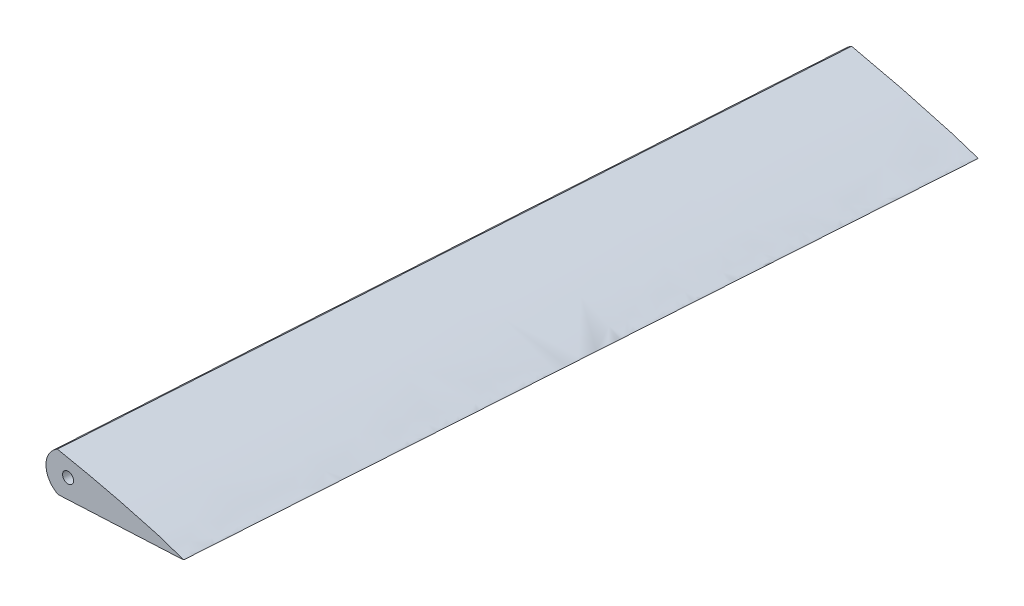
ISO-10303-21;
HEADER;
FILE_DESCRIPTION(('STEP AP214'),'2;1');
FILE_NAME('part.step','',(''),(''),'','','');
FILE_SCHEMA(('AUTOMOTIVE_DESIGN { 1 0 10303 214 1 1 1 1 }'));
ENDSEC;
DATA;
#1=APPLICATION_CONTEXT('core data for automotive mechanical design processes');
#2=APPLICATION_PROTOCOL_DEFINITION('international standard','automotive_design',2000,#1);
#3=PRODUCT_CONTEXT('',#1,'mechanical');
#4=PRODUCT('Part','Part','',(#3));
#5=PRODUCT_RELATED_PRODUCT_CATEGORY('part','',(#4));
#6=PRODUCT_DEFINITION_FORMATION('','',#4);
#7=PRODUCT_DEFINITION_CONTEXT('part definition',#1,'design');
#8=PRODUCT_DEFINITION('design','',#6,#7);
#9=PRODUCT_DEFINITION_SHAPE('','',#8);
#10=(LENGTH_UNIT() NAMED_UNIT(*) SI_UNIT(.MILLI.,.METRE.));
#11=(NAMED_UNIT(*) PLANE_ANGLE_UNIT() SI_UNIT($,.RADIAN.));
#12=(NAMED_UNIT(*) SI_UNIT($,.STERADIAN.) SOLID_ANGLE_UNIT());
#13=UNCERTAINTY_MEASURE_WITH_UNIT(LENGTH_MEASURE(1.E-05),#10,'distance_accuracy_value','');
#14=(GEOMETRIC_REPRESENTATION_CONTEXT(3) GLOBAL_UNCERTAINTY_ASSIGNED_CONTEXT((#13)) GLOBAL_UNIT_ASSIGNED_CONTEXT((#10,
#11,#12)) REPRESENTATION_CONTEXT('',''));
#15=CARTESIAN_POINT('',(0.,0.,0.));
#16=DIRECTION('',(0.,0.,1.));
#17=DIRECTION('',(1.,0.,0.));
#18=AXIS2_PLACEMENT_3D('',#15,#16,#17);
#19=CARTESIAN_POINT('',(116.506559430036,-5.01166499395291,300.));
#20=DIRECTION('',(0.,0.,-1.));
#21=DIRECTION('',(-1.,0.,0.));
#22=AXIS2_PLACEMENT_3D('',#19,#20,#21);
#23=PLANE('',#22);
#24=CARTESIAN_POINT('',(79.0070440421193,2.39921606308295,300.));
#25=DIRECTION('',(0.,0.,-1.));
#26=DIRECTION('',(-0.999407136814944,-0.0344292736396727,0.));
#27=AXIS2_PLACEMENT_3D('',#24,#25,#26);
#28=ELLIPSE('',#27,1.00226341484275,0.999999999999993);
#29=CARTESIAN_POINT('',(78.005374832357,2.36470886171429,300.));
#30=VERTEX_POINT('',#29);
#31=EDGE_CURVE('E58',#30,#30,#28,.F.);
#32=ORIENTED_EDGE('',*,*,#31,.F.);
#33=EDGE_LOOP('',(#32));
#34=FACE_BOUND('',#33,.T.);
#35=CARTESIAN_POINT('',(100.,0.,300.));
#36=CARTESIAN_POINT('',(100.014923169262,0.0592388089626518,300.));
#37=CARTESIAN_POINT('',(98.3529769440514,0.511038186945055,300.));
#38=CARTESIAN_POINT('',(97.0969794574008,1.03966162187566,300.));
#39=CARTESIAN_POINT('',(94.4018178812771,1.80139976342404,300.));
#40=CARTESIAN_POINT('',(91.5774953760021,2.59080174867619,300.));
#41=CARTESIAN_POINT('',(88.1259798370144,3.47753080508084,300.));
#42=CARTESIAN_POINT('',(84.2217100096211,4.40446850526963,300.));
#43=CARTESIAN_POINT('',(79.8953408602356,5.35215076036016,300.));
#44=CARTESIAN_POINT('',(75.2308646597816,6.2701026833677,300.));
#45=CARTESIAN_POINT('',(70.3041328387238,7.11696708440821,300.));
#46=CARTESIAN_POINT('',(65.2008228846164,7.85540207923427,300.));
#47=CARTESIAN_POINT('',(60.0084258675896,8.45749052318448,300.));
#48=CARTESIAN_POINT('',(54.8154414029379,8.89296179445461,300.));
#49=CARTESIAN_POINT('',(49.7087787786779,9.11718139088869,300.));
#50=CARTESIAN_POINT('',(44.7749515151268,9.08549151114679,300.));
#51=CARTESIAN_POINT('',(40.1001215647839,8.78047675865518,300.));
#52=CARTESIAN_POINT('',(35.7650377112056,8.22003855734951,300.));
#53=CARTESIAN_POINT('',(31.8431393592005,7.43515761318965,300.));
#54=CARTESIAN_POINT('',(28.3975621307644,6.47381434625063,300.));
#55=CARTESIAN_POINT('',(25.4743709849585,5.36057571079238,300.));
#56=CARTESIAN_POINT('',(23.1643125092464,4.08874700360212,300.));
#57=CARTESIAN_POINT('',(21.4182453437574,2.80505456301613,300.));
#58=CARTESIAN_POINT('',(20.3342940907016,1.4857636098498,300.));
#59=CARTESIAN_POINT('',(19.848876137766,0.16094790784733,300.));
#60=CARTESIAN_POINT('',(20.5607003857686,-1.62078308380909,300.));
#61=CARTESIAN_POINT('',(23.3461486495499,-2.47062334575145,300.));
#62=CARTESIAN_POINT('',(27.0944757373181,-3.21353066773721,300.));
#63=CARTESIAN_POINT('',(32.0919146293912,-3.38211658366619,300.));
#64=CARTESIAN_POINT('',(38.0597809883925,-3.29061362877646,300.));
#65=CARTESIAN_POINT('',(44.8910379391885,-2.95007097060458,300.));
#66=CARTESIAN_POINT('',(52.2961856480144,-2.58123272556939,300.));
#67=CARTESIAN_POINT('',(60.0015784426429,-2.17844007735752,300.));
#68=CARTESIAN_POINT('',(67.7029961352897,-1.72772962023577,300.));
#69=CARTESIAN_POINT('',(75.1137779773506,-1.27940221867296,300.));
#70=CARTESIAN_POINT('',(81.9255850266116,-0.915018444337756,300.));
#71=CARTESIAN_POINT('',(87.9561922617108,-0.63965732422303,300.));
#72=CARTESIAN_POINT('',(92.7389461096696,-0.400523517451224,300.));
#73=CARTESIAN_POINT('',(96.6958495882715,-0.306482613810462,300.));
#74=CARTESIAN_POINT('',(98.3883941773635,-0.0811743747246907,300.));
#75=CARTESIAN_POINT('',(99.9859090432853,-0.0559352693961097,300.));
#76=CARTESIAN_POINT('',(100.,0.,300.));
#77=B_SPLINE_CURVE_WITH_KNOTS('',3,(#35,#36,#37,#38,#39,#40,#41,#42,#43,#44,#45,#46,#47,#48,#49,
#50,#51,#52,#53,#54,#55,#56,#57,#58,#59,#60,#61,#62,#63,#64,#65,#66,#67,#68,#69,#70,#71,#72,#73,
#74,#75,#76),.UNSPECIFIED.,.T.,.F.,(4,1,1,1,1,1,1,1,1,1,1,1,1,1,1,1,1,1,1,1,1,1,1,1,1,1,1,1,1,1,
1,1,1,1,1,1,1,1,1,4),(0.,0.00495576371400358,0.0195005280764471,0.0341339283486635,
0.0524049542143257,0.0739943309224443,0.0984931531585991,0.125474601337429,0.154451971064024,
0.184909300231469,0.216326676925909,0.248168985989691,0.279908729565615,0.311030457196045,
0.341049811862573,0.369546227571225,0.396130574732561,0.420447044709539,0.442179640217013,
0.461102572305862,0.477136471921637,0.490041484410884,0.500147947583578,0.508077763123304,
0.514148335024584,0.53273119249296,0.555552546441872,0.58573949839938,0.622463906786317,
0.664407467873401,0.709926080574513,0.757276032828189,0.804638844685232,0.850179122578555,
0.892141924950279,0.928905522286394,0.959074072533095,0.981494735532468,0.995320601759886,1.),.UNSPECIFIED.);
#78=CARTESIAN_POINT('',(77.2030403463395,-1.17079988015967,300.));
#79=VERTEX_POINT('',#78);
#80=CARTESIAN_POINT('',(77.0720573084049,5.90216616041599,300.));
#81=VERTEX_POINT('',#80);
#82=EDGE_CURVE('E86',#79,#81,#77,.T.);
#83=ORIENTED_EDGE('',*,*,#82,.T.);
#84=CARTESIAN_POINT('',(79.009263679597,2.40043779807845,300.));
#85=DIRECTION('',(0.,0.,-1.));
#86=DIRECTION('',(0.99955910558253,0.0296916561857644,0.));
#87=AXIS2_PLACEMENT_3D('',#84,#85,#86);
#88=ELLIPSE('',#87,4.00888703081333,4.);
#89=EDGE_CURVE('E81',#79,#81,#88,.T.);
#90=ORIENTED_EDGE('',*,*,#89,.F.);
#91=EDGE_LOOP('',(#83,#90));
#92=FACE_BOUND('',#91,.T.);
#93=ADVANCED_FACE('F51',(#34,#92),#23,.F.);
#94=CARTESIAN_POINT('',(84.0004709817086,-6.2458455088739,165.));
#95=DIRECTION('',(0.,0.,-1.));
#96=DIRECTION('',(-1.,0.,0.));
#97=AXIS2_PLACEMENT_3D('',#94,#95,#96);
#98=PLANE('',#97);
#99=CARTESIAN_POINT('',(88.0093501864415,2.66778314335208,165.));
#100=DIRECTION('',(0.,0.,-1.));
#101=DIRECTION('',(0.99955910558253,0.0296916561857644,0.));
#102=AXIS2_PLACEMENT_3D('',#99,#100,#101);
#103=ELLIPSE('',#102,1.00222175770333,0.999999999999997);
#104=CARTESIAN_POINT('',(89.0111300701667,2.6975407672037,165.));
#105=VERTEX_POINT('',#104);
#106=EDGE_CURVE('E91',#105,#105,#103,.T.);
#107=ORIENTED_EDGE('',*,*,#106,.F.);
#108=EDGE_LOOP('',(#107));
#109=FACE_BOUND('',#108,.T.);
#110=CARTESIAN_POINT('',(88.0093501864414,2.66778314335208,165.));
#111=DIRECTION('',(0.,0.,-1.));
#112=DIRECTION('',(0.99955910558253,0.0296916561857644,0.));
#113=AXIS2_PLACEMENT_3D('',#110,#111,#112);
#114=ELLIPSE('',#113,4.00888703081333,4.);
#115=CARTESIAN_POINT('',(86.0816494037055,6.17473102255661,165.000000000001));
#116=VERTEX_POINT('',#115);
#117=CARTESIAN_POINT('',(86.7681154949798,-1.13582714403182,165.));
#118=VERTEX_POINT('',#117);
#119=EDGE_CURVE('E13',#116,#118,#114,.F.);
#120=ORIENTED_EDGE('',*,*,#119,.F.);
#121=CARTESIAN_POINT('',(84.0004709817086,-1.27715482212734,165.));
#122=CARTESIAN_POINT('',(84.4103416419567,-1.25569715642511,165.));
#123=CARTESIAN_POINT('',(84.8202241691838,-1.23446558416985,165.));
#124=CARTESIAN_POINT('',(85.6400125913986,-1.19247616326863,165.));
#125=CARTESIAN_POINT('',(86.0499184863336,-1.17171831359439,165.));
#126=CARTESIAN_POINT('',(86.8697547087213,-1.13069779866227,165.));
#127=CARTESIAN_POINT('',(87.2796850361529,-1.11043513298336,165.));
#128=CARTESIAN_POINT('',(88.0995680016719,-1.07036447933727,165.));
#129=CARTESIAN_POINT('',(88.5095206397663,-1.05055649151186,165.));
#130=CARTESIAN_POINT('',(89.3294162844653,-1.01124581815784,165.));
#131=CARTESIAN_POINT('',(89.7393592902124,-0.991743114695151,165.));
#132=CARTESIAN_POINT('',(90.5592530479397,-0.952913234080104,165.));
#133=CARTESIAN_POINT('',(90.9692037999087,-0.933586056692733,165.));
#134=CARTESIAN_POINT('',(91.7891058212412,-0.894973491753583,165.));
#135=CARTESIAN_POINT('',(92.1990570905978,-0.875688104055088,165.));
#136=CARTESIAN_POINT('',(93.0189527840079,-0.837022356387112,165.));
#137=CARTESIAN_POINT('',(93.4288972080873,-0.817641996968352,165.));
#138=CARTESIAN_POINT('',(94.0438206110605,-0.788400815355857,165.));
#139=CARTESIAN_POINT('',(94.2488036249985,-0.778624957527131,165.));
#140=CARTESIAN_POINT('',(94.6587656109629,-0.758988890726824,165.));
#141=CARTESIAN_POINT('',(94.8637445829891,-0.749128681754949,165.));
#142=CARTESIAN_POINT('',(95.4786801258529,-0.719499721356093,165.));
#143=CARTESIAN_POINT('',(95.8886343703241,-0.699682682070747,165.));
#144=CARTESIAN_POINT('',(96.7085731090096,-0.660568051507781,165.));
#145=CARTESIAN_POINT('',(97.1185576035439,-0.641270466886279,165.));
#146=CARTESIAN_POINT('',(97.9385905393802,-0.603800688968483,165.));
#147=CARTESIAN_POINT('',(98.3486389821818,-0.58562852804694,165.));
#148=CARTESIAN_POINT('',(98.963781505587,-0.559623011972516,165.));
#149=CARTESIAN_POINT('',(99.1688490750589,-0.55116297263522,165.));
#150=CARTESIAN_POINT('',(99.5790033538564,-0.534722937819139,165.));
#151=CARTESIAN_POINT('',(99.7840900631696,-0.526742942031726,165.));
#152=CARTESIAN_POINT('',(100.194281022082,-0.511306158537653,165.));
#153=CARTESIAN_POINT('',(100.399385271464,-0.50384936507924,165.));
#154=CARTESIAN_POINT('',(100.80961507413,-0.489550420527161,165.));
#155=CARTESIAN_POINT('',(101.014740627413,-0.482708269397327,165.));
#156=CARTESIAN_POINT('',(101.424968991849,-0.469287282036709,165.));
#157=CARTESIAN_POINT('',(101.630071801735,-0.462708406042353,165.));
#158=CARTESIAN_POINT('',(102.040272236234,-0.449367826696778,165.));
#159=CARTESIAN_POINT('',(102.245369860829,-0.442606122786973,165.));
#160=CARTESIAN_POINT('',(102.655482707591,-0.428474728623181,165.));
#161=CARTESIAN_POINT('',(102.860497935961,-0.421105222242066,165.));
#162=CARTESIAN_POINT('',(103.270485201541,-0.405265834453187,165.));
#163=CARTESIAN_POINT('',(103.475457239084,-0.396795961881638,165.));
#164=CARTESIAN_POINT('',(103.953829192812,-0.37507965071539,165.));
#165=CARTESIAN_POINT('',(104.227200188111,-0.361182935817716,165.));
#166=CARTESIAN_POINT('',(104.773668154181,-0.328493470663739,165.));
#167=CARTESIAN_POINT('',(105.04676513065,-0.309700824425825,165.));
#168=CARTESIAN_POINT('',(105.455950491974,-0.275618700778907,165.));
#169=CARTESIAN_POINT('',(105.59228620906,-0.263273858860942,165.));
#170=CARTESIAN_POINT('',(105.864905001727,-0.237997029188464,165.));
#171=CARTESIAN_POINT('',(106.001188075157,-0.225065019577515,165.));
#172=CARTESIAN_POINT('',(106.273808745056,-0.199991214415701,165.));
#173=CARTESIAN_POINT('',(106.410146330103,-0.187849299166084,165.));
#174=CARTESIAN_POINT('',(106.682961992422,-0.165249155483847,165.));
#175=CARTESIAN_POINT('',(106.819440068353,-0.154790911140536,165.));
#176=CARTESIAN_POINT('',(107.092490185567,-0.135884193843918,165.));
#177=CARTESIAN_POINT('',(107.22906217975,-0.127435045497121,165.));
#178=CARTESIAN_POINT('',(107.433999620646,-0.116238722781415,165.));
#179=CARTESIAN_POINT('',(107.502325609588,-0.112752837779722,165.));
#180=CARTESIAN_POINT('',(107.63899926504,-0.106256279727433,165.));
#181=CARTESIAN_POINT('',(107.707346931238,-0.103245600088677,165.));
#182=CARTESIAN_POINT('',(107.844057496222,-0.0976571785616634,165.));
#183=CARTESIAN_POINT('',(107.912420394361,-0.0950794208619492,165.));
#184=CARTESIAN_POINT('',(108.049164897149,-0.0903986649222256,165.));
#185=CARTESIAN_POINT('',(108.117546502418,-0.0882956850197032,165.));
#186=CARTESIAN_POINT('',(108.254303896219,-0.084116864240028,165.));
#187=CARTESIAN_POINT('',(108.322679684756,-0.0820410210972266,165.));
#188=CARTESIAN_POINT('',(108.459407424323,-0.0772334150645194,165.));
#189=CARTESIAN_POINT('',(108.527759376866,-0.074501706958404,165.000000000001));
#190=CARTESIAN_POINT('',(108.621681028363,-0.0695003133153018,165.));
#191=CARTESIAN_POINT('',(108.647290399123,-0.0680088856002922,165.));
#192=CARTESIAN_POINT('',(108.698501417009,-0.0646331217198025,165.));
#193=CARTESIAN_POINT('',(108.724103046131,-0.0627485108103346,165.));
#194=CARTESIAN_POINT('',(108.775323016005,-0.0583797320458168,165.));
#195=CARTESIAN_POINT('',(108.80094124266,-0.0558940991838619,165.));
#196=CARTESIAN_POINT('',(108.839258347011,-0.0513626407814158,165.));
#197=CARTESIAN_POINT('',(108.852004382863,-0.0497196014764735,165.));
#198=CARTESIAN_POINT('',(108.877439225853,-0.0460426680906321,165.));
#199=CARTESIAN_POINT('',(108.89012804859,-0.0440088880810831,165.));
#200=CARTESIAN_POINT('',(108.909106096112,-0.0404777015098497,165.));
#201=CARTESIAN_POINT('',(108.915439093197,-0.0392166945512332,165.));
#202=CARTESIAN_POINT('',(108.928069405772,-0.0364731088146159,165.));
#203=CARTESIAN_POINT('',(108.934366646354,-0.0349901725272463,165.));
#204=CARTESIAN_POINT('',(108.946865158993,-0.0317085428554671,165.));
#205=CARTESIAN_POINT('',(108.953066588995,-0.0299104473582869,165.));
#206=CARTESIAN_POINT('',(108.965301520463,-0.025821163151919,165.));
#207=CARTESIAN_POINT('',(108.971335484228,-0.0235315254398327,165.));
#208=CARTESIAN_POINT('',(108.980083016132,-0.019356233156859,165.));
#209=CARTESIAN_POINT('',(108.982964435007,-0.0178297088839567,165.));
#210=CARTESIAN_POINT('',(108.988474377334,-0.0143926169977385,165.));
#211=CARTESIAN_POINT('',(108.99110493124,-0.0124856044564001,165.));
#212=CARTESIAN_POINT('',(108.995079328192,-0.00871806218870991,165.));
#213=CARTESIAN_POINT('',(108.996570463479,-0.00702231208159344,165.));
#214=CARTESIAN_POINT('',(108.998970284335,-0.0031836090448728,165.));
#215=CARTESIAN_POINT('',(108.999872399654,-0.001035953480455,165.));
#216=CARTESIAN_POINT('',(109.000580935688,0.00313176371472825,165.));
#217=CARTESIAN_POINT('',(109.0005215466,0.0051284430363144,165.));
#218=CARTESIAN_POINT('',(108.999685612154,0.00949366478104291,165.));
#219=CARTESIAN_POINT('',(108.998720500731,0.0118178094589111,165.));
#220=CARTESIAN_POINT('',(108.995293380904,0.0180285707610725,165.));
#221=CARTESIAN_POINT('',(108.99225695286,0.0215535643421259,165.));
#222=CARTESIAN_POINT('',(108.985464588534,0.0282597617805181,165.000000000001));
#223=CARTESIAN_POINT('',(108.981672666853,0.0313981745667922,165.));
#224=CARTESIAN_POINT('',(108.973803161631,0.0373032740478364,165.));
#225=CARTESIAN_POINT('',(108.969725379741,0.0400696986700071,165.));
#226=CARTESIAN_POINT('',(108.9572011448,0.0480487361020721,165.));
#227=CARTESIAN_POINT('',(108.948526141966,0.0528904460455542,165.));
#228=CARTESIAN_POINT('',(108.922447229655,0.0665031963286258,165.000000000001));
#229=CARTESIAN_POINT('',(108.904687204034,0.074564822193664,165.));
#230=CARTESIAN_POINT('',(108.868790585966,0.0898413196265918,165.));
#231=CARTESIAN_POINT('',(108.850653415679,0.0970547587485712,165.));
#232=CARTESIAN_POINT('',(108.814270542483,0.110918695354301,165.));
#233=CARTESIAN_POINT('',(108.796025860784,0.117571869453267,165.));
#234=CARTESIAN_POINT('',(108.759430358478,0.130528369041943,165.));
#235=CARTESIAN_POINT('',(108.741079631675,0.136831963154333,165.));
#236=CARTESIAN_POINT('',(108.686048260011,0.155331694338639,165.));
#237=CARTESIAN_POINT('',(108.649247103983,0.167168455771142,165.));
#238=CARTESIAN_POINT('',(108.575467128767,0.190308133845587,165.));
#239=CARTESIAN_POINT('',(108.538488256391,0.201610878077935,165.));
#240=CARTESIAN_POINT('',(108.464396372031,0.223900547065056,165.));
#241=CARTESIAN_POINT('',(108.427283264525,0.234887153754751,165.));
#242=CARTESIAN_POINT('',(108.353007338806,0.256676867411122,165.));
#243=CARTESIAN_POINT('',(108.315844525621,0.267479991618901,165.));
#244=CARTESIAN_POINT('',(108.229119591616,0.292590738806228,165.));
#245=CARTESIAN_POINT('',(108.179548601584,0.30686766530006,165.));
#246=CARTESIAN_POINT('',(108.080442424533,0.335545037372523,165.));
#247=CARTESIAN_POINT('',(108.03090723741,0.349945482595015,165.));
#248=CARTESIAN_POINT('',(107.882409645839,0.393517521640829,165.));
#249=CARTESIAN_POINT('',(107.783555584118,0.42305971344789,165.));
#250=CARTESIAN_POINT('',(107.586164224395,0.483149741629783,165.));
#251=CARTESIAN_POINT('',(107.487626896262,0.513697479041724,165.));
#252=CARTESIAN_POINT('',(107.290932220536,0.575873287818775,165.));
#253=CARTESIAN_POINT('',(107.192774749202,0.607500967306634,165.));
#254=CARTESIAN_POINT('',(106.996815527779,0.67186277871144,165.));
#255=CARTESIAN_POINT('',(106.89901380405,0.704596990837293,165.));
#256=CARTESIAN_POINT('',(106.703745889958,0.771092163011277,165.));
#257=CARTESIAN_POINT('',(106.60627974571,0.804853258359571,165.));
#258=CARTESIAN_POINT('',(106.362775479018,0.890340842003369,165.));
#259=CARTESIAN_POINT('',(106.216917562955,0.942577547688623,165.));
#260=CARTESIAN_POINT('',(105.925289291672,1.04729726658099,165.));
#261=CARTESIAN_POINT('',(105.779518937197,1.0997802818476,165.));
#262=CARTESIAN_POINT('',(105.560401718008,1.1771234459983,165.));
#263=CARTESIAN_POINT('',(105.487298832119,1.20266982215903,165.));
#264=CARTESIAN_POINT('',(105.340858225659,1.25307989584688,165.));
#265=CARTESIAN_POINT('',(105.267520506758,1.27794359821539,165.));
#266=CARTESIAN_POINT('',(105.12059869703,1.3269309141542,165.));
#267=CARTESIAN_POINT('',(105.047014606747,1.35105452935837,165.));
#268=CARTESIAN_POINT('',(104.899654874437,1.39871040614696,165.));
#269=CARTESIAN_POINT('',(104.825879230498,1.42224266180379,165.));
#270=CARTESIAN_POINT('',(104.604323835838,1.49208174612455,165.));
#271=CARTESIAN_POINT('',(104.456306205438,1.53763400218806,165.));
#272=CARTESIAN_POINT('',(104.159836550281,1.62730337412039,165.));
#273=CARTESIAN_POINT('',(104.011384517669,1.67142046386121,165.));
#274=CARTESIAN_POINT('',(103.714159837027,1.75863699229427,165.));
#275=CARTESIAN_POINT('',(103.565387146915,1.80173628725555,165.));
#276=CARTESIAN_POINT('',(103.267646842768,1.88724885202735,165.));
#277=CARTESIAN_POINT('',(103.118679230597,1.92966212834803,165.));
#278=CARTESIAN_POINT('',(102.820667507505,2.01407768169579,165.));
#279=CARTESIAN_POINT('',(102.671623424472,2.0560800574075,165.));
#280=CARTESIAN_POINT('',(102.373509051086,2.13999266764502,165.));
#281=CARTESIAN_POINT('',(102.224438760679,2.1819029019769,165.));
#282=CARTESIAN_POINT('',(101.926259836243,2.26565030990114,165.));
#283=CARTESIAN_POINT('',(101.777151199796,2.30748747489549,165.));
#284=CARTESIAN_POINT('',(101.478897459077,2.39103112584758,165.));
#285=CARTESIAN_POINT('',(101.329752354833,2.43273761191274,165.));
#286=CARTESIAN_POINT('',(100.882229275775,2.55760944949815,165.));
#287=CARTESIAN_POINT('',(100.583780745531,2.64052233618278,165.));
#288=CARTESIAN_POINT('',(99.9866025744801,2.80534296693615,165.));
#289=CARTESIAN_POINT('',(99.6878729308998,2.88725070097479,165.));
#290=CARTESIAN_POINT('',(99.2047596541887,3.01857001812113,165.));
#291=CARTESIAN_POINT('',(99.0204870888448,3.06839014265215,165.));
#292=CARTESIAN_POINT('',(98.6517916262215,3.16747098550122,165.));
#293=CARTESIAN_POINT('',(98.4673687289264,3.21673170376138,165.));
#294=CARTESIAN_POINT('',(97.9138874123455,3.36371575391646,165.));
#295=CARTESIAN_POINT('',(97.5446167896488,3.4606408667026,165.));
#296=CARTESIAN_POINT('',(96.8055970763784,3.65251955070164,165.));
#297=CARTESIAN_POINT('',(96.4358480283371,3.74747328588241,165.));
#298=CARTESIAN_POINT('',(95.6958870446162,3.93555786602686,165.));
#299=CARTESIAN_POINT('',(95.3256751089514,4.02868871104824,165.));
#300=CARTESIAN_POINT('',(94.2144166848493,4.30554464845639,165.));
#301=CARTESIAN_POINT('',(93.4727376723592,4.48673570758173,165.));
#302=CARTESIAN_POINT('',(91.9878196757706,4.84279408663726,165.));
#303=CARTESIAN_POINT('',(91.2445806036159,5.01766103886754,165.));
#304=CARTESIAN_POINT('',(90.128696055816,5.27556703898393,165.));
#305=CARTESIAN_POINT('',(89.7565573150391,5.36080469034933,165.));
#306=CARTESIAN_POINT('',(89.0119537257551,5.52984345076237,165.));
#307=CARTESIAN_POINT('',(88.6394888771302,5.61364455929036,165.));
#308=CARTESIAN_POINT('',(87.5216058673205,5.86281971139992,165.));
#309=CARTESIAN_POINT('',(86.7756891284573,6.02596792057702,165.));
#310=CARTESIAN_POINT('',(85.8601844927598,6.22220777645692,165.));
#311=CARTESIAN_POINT('',(85.6912272288744,6.25825714769351,165.));
#312=CARTESIAN_POINT('',(85.3532452328263,6.33003266634736,165.));
#313=CARTESIAN_POINT('',(85.1842205011584,6.36575881609191,165.));
#314=CARTESIAN_POINT('',(84.8461157348565,6.43688159607453,165.));
#315=CARTESIAN_POINT('',(84.6770357056676,6.47227825220611,165.));
#316=CARTESIAN_POINT('',(84.3388055826809,6.54274178946506,165.));
#317=CARTESIAN_POINT('',(84.1696554883518,6.57780866804182,165.));
#318=CARTESIAN_POINT('',(84.0004709817086,6.61270882124739,165.));
#319=B_SPLINE_CURVE_WITH_KNOTS('',3,(#121,#122,#123,#124,#125,#126,#127,#128,#129,#130,#131,
#132,#133,#134,#135,#136,#137,#138,#139,#140,#141,#142,#143,#144,#145,#146,#147,#148,#149,#150,
#151,#152,#153,#154,#155,#156,#157,#158,#159,#160,#161,#162,#163,#164,#165,#166,#167,#168,#169,
#170,#171,#172,#173,#174,#175,#176,#177,#178,#179,#180,#181,#182,#183,#184,#185,#186,#187,#188,
#189,#190,#191,#192,#193,#194,#195,#196,#197,#198,#199,#200,#201,#202,#203,#204,#205,#206,#207,
#208,#209,#210,#211,#212,#213,#214,#215,#216,#217,#218,#219,#220,#221,#222,#223,#224,#225,#226,
#227,#228,#229,#230,#231,#232,#233,#234,#235,#236,#237,#238,#239,#240,#241,#242,#243,#244,#245,
#246,#247,#248,#249,#250,#251,#252,#253,#254,#255,#256,#257,#258,#259,#260,#261,#262,#263,#264,
#265,#266,#267,#268,#269,#270,#271,#272,#273,#274,#275,#276,#277,#278,#279,#280,#281,#282,#283,
#284,#285,#286,#287,#288,#289,#290,#291,#292,#293,#294,#295,#296,#297,#298,#299,#300,#301,#302,
#303,#304,#305,#306,#307,#308,#309,#310,#311,#312,#313,#314,#315,#316,#317,#318),.UNSPECIFIED.,
.F.,.F.,(4,2,2,2,2,2,2,2,2,2,2,2,2,2,2,2,2,2,2,2,2,2,2,2,2,2,2,2,2,2,2,2,2,2,2,2,2,2,2,2,2,2,2,
2,2,2,2,2,2,2,2,2,2,2,2,2,2,2,2,2,2,2,2,2,2,2,2,2,2,2,2,2,2,2,2,2,2,2,2,2,2,2,2,2,2,2,2,2,2,2,2,
2,2,2,2,2,2,2,4),(0.,1.23129584875885,2.4625890246136,3.69388115353919,4.92517366634959,
6.15639357271801,7.38761183037289,8.61882575849515,9.85003255547913,10.4656805162647,
11.0813284792071,12.312627267819,13.5439418263779,14.7752917893832,15.3910173180947,
16.0067424509418,16.622460813839,17.2381791405044,17.8538041188878,18.4694309783798,
19.0848722763267,19.7003086324314,20.52146208686,21.34259809658,21.7532703961064,
22.1639579948449,22.5745832291362,22.9852045827908,23.3956877029773,23.6009308664483,
23.8061711842157,24.0114040044315,24.2166447500612,24.4218682492691,24.6270746123091,
24.7040305813165,24.7810405059203,24.8582400708594,24.8967915256499,24.9353317429304,
24.9547015161244,24.9741028351199,24.9934677386498,25.0127724140328,25.0225411621965,
25.0322225844204,25.0389377070025,25.0457265090227,25.0515771393688,25.0590011494162,
25.0727681564398,25.0875225778868,25.1022873402371,25.1320557589187,25.1905094045146,
25.2490603922495,25.3073135792642,25.3655213650767,25.4814856889356,25.5974872000208,
25.7136016053315,25.829705038796,25.9844629523502,26.1392204198457,26.4487365174008,
26.7582222438201,27.0675968366914,27.3769939033997,27.6864319137848,28.151217104931,
28.6160061892925,28.8483175258257,29.0806272144244,29.3129363901244,29.5452478934867,
30.0098411516848,30.4744428633336,30.9391097974454,31.4037723193871,31.868320361051,
32.3328693795164,32.7974698043327,33.2620698471287,34.1913235715489,35.1205865611827,
35.6932512792205,36.2659160565157,37.4112469207745,38.5564821382308,39.7017173194309,
41.9921569826562,44.2827296045594,45.4280542414926,46.5733792927348,48.8639982538887,
49.3822790065745,49.9005560244977,50.4187919634032,50.9370319072335),.UNSPECIFIED.);
#320=EDGE_CURVE('E63',#118,#116,#319,.T.);
#321=ORIENTED_EDGE('',*,*,#320,.F.);
#322=EDGE_LOOP('',(#120,#321));
#323=FACE_BOUND('',#322,.T.);
#324=ADVANCED_FACE('F113',(#109,#323),#98,.T.);
#325=CARTESIAN_POINT('',(120.,0.,0.));
#326=CARTESIAN_POINT('',(100.,0.,300.));
#327=CARTESIAN_POINT('',(120.022384753893,0.0888582134439777,0.));
#328=CARTESIAN_POINT('',(100.014923169262,0.0592388089626518,300.));
#329=CARTESIAN_POINT('',(117.529465416077,0.766557280417583,0.));
#330=CARTESIAN_POINT('',(98.3529769440514,0.511038186945055,300.));
#331=CARTESIAN_POINT('',(115.645469186101,1.5594924328135,0.));
#332=CARTESIAN_POINT('',(97.0969794574008,1.03966162187566,300.));
#333=CARTESIAN_POINT('',(111.602726821916,2.70209964513606,0.));
#334=CARTESIAN_POINT('',(94.4018178812771,1.80139976342404,300.));
#335=CARTESIAN_POINT('',(107.366243064003,3.88620262301428,0.));
#336=CARTESIAN_POINT('',(91.5774953760021,2.59080174867619,300.));
#337=CARTESIAN_POINT('',(102.188969755522,5.21629620762126,0.));
#338=CARTESIAN_POINT('',(88.1259798370144,3.47753080508084,300.));
#339=CARTESIAN_POINT('',(96.3325650144317,6.60670275790445,0.));
#340=CARTESIAN_POINT('',(84.2217100096211,4.40446850526963,300.));
#341=CARTESIAN_POINT('',(89.8430112903535,8.02822614054024,0.));
#342=CARTESIAN_POINT('',(79.8953408602356,5.35215076036016,300.));
#343=CARTESIAN_POINT('',(82.8462969896723,9.40515402505156,0.));
#344=CARTESIAN_POINT('',(75.2308646597816,6.2701026833677,300.));
#345=CARTESIAN_POINT('',(75.4561992580857,10.6754506266123,0.));
#346=CARTESIAN_POINT('',(70.3041328387238,7.11696708440821,300.));
#347=CARTESIAN_POINT('',(67.8012343269246,11.7831031188514,0.));
#348=CARTESIAN_POINT('',(65.2008228846164,7.85540207923427,300.));
#349=CARTESIAN_POINT('',(60.0126388013843,12.6862357847767,0.));
#350=CARTESIAN_POINT('',(60.0084258675896,8.45749052318448,300.));
#351=CARTESIAN_POINT('',(52.2231621044069,13.3394426916819,0.));
#352=CARTESIAN_POINT('',(54.8154414029379,8.89296179445461,300.));
#353=CARTESIAN_POINT('',(44.5631681680168,13.675772086333,0.));
#354=CARTESIAN_POINT('',(49.7087787786779,9.11718139088869,300.));
#355=CARTESIAN_POINT('',(37.1624272726901,13.6282372667202,0.));
#356=CARTESIAN_POINT('',(44.7749515151268,9.08549151114679,300.));
#357=CARTESIAN_POINT('',(30.1501823471758,13.1707151379828,0.));
#358=CARTESIAN_POINT('',(40.1001215647839,8.78047675865518,300.));
#359=CARTESIAN_POINT('',(23.6475565668083,12.3300578360243,0.));
#360=CARTESIAN_POINT('',(35.7650377112056,8.22003855734951,300.));
#361=CARTESIAN_POINT('',(17.7647090388008,11.1527364197845,0.));
#362=CARTESIAN_POINT('',(31.8431393592005,7.43515761318965,300.));
#363=CARTESIAN_POINT('',(12.5963431961465,9.71072151937595,0.));
#364=CARTESIAN_POINT('',(28.3975621307644,6.47381434625063,300.));
#365=CARTESIAN_POINT('',(8.21155647743776,8.04086356618857,0.));
#366=CARTESIAN_POINT('',(25.4743709849585,5.36057571079238,300.));
#367=CARTESIAN_POINT('',(4.74646876386956,6.13312050540317,0.));
#368=CARTESIAN_POINT('',(23.1643125092464,4.08874700360212,300.));
#369=CARTESIAN_POINT('',(2.12736801563615,4.2075818445242,0.));
#370=CARTESIAN_POINT('',(21.4182453437574,2.80505456301613,300.));
#371=CARTESIAN_POINT('',(0.501441136052392,2.2286454147747,0.));
#372=CARTESIAN_POINT('',(20.3342940907016,1.4857636098498,300.));
#373=CARTESIAN_POINT('',(-0.226685793350984,0.241421861770996,0.));
#374=CARTESIAN_POINT('',(19.848876137766,0.16094790784733,300.));
#375=CARTESIAN_POINT('',(0.841050578652947,-2.43117462571363,0.));
#376=CARTESIAN_POINT('',(20.5607003857686,-1.62078308380909,300.));
#377=CARTESIAN_POINT('',(5.01922297432486,-3.70593501862717,0.));
#378=CARTESIAN_POINT('',(23.3461486495499,-2.47062334575145,300.));
#379=CARTESIAN_POINT('',(10.6417136059772,-4.82029600160582,0.));
#380=CARTESIAN_POINT('',(27.0944757373181,-3.21353066773721,300.));
#381=CARTESIAN_POINT('',(18.1378719440869,-5.07317487549928,0.));
#382=CARTESIAN_POINT('',(32.0919146293912,-3.38211658366619,300.));
#383=CARTESIAN_POINT('',(27.0896714825887,-4.93592044316468,0.));
#384=CARTESIAN_POINT('',(38.0597809883925,-3.29061362877646,300.));
#385=CARTESIAN_POINT('',(37.3365569087827,-4.42510645590687,0.));
#386=CARTESIAN_POINT('',(44.8910379391885,-2.95007097060458,300.));
#387=CARTESIAN_POINT('',(48.4442784720216,-3.87184908835409,0.));
#388=CARTESIAN_POINT('',(52.2961856480144,-2.58123272556939,300.));
#389=CARTESIAN_POINT('',(60.0023676639643,-3.26766011603629,0.));
#390=CARTESIAN_POINT('',(60.0015784426429,-2.17844007735752,300.));
#391=CARTESIAN_POINT('',(71.5544942029345,-2.59159443035365,0.));
#392=CARTESIAN_POINT('',(67.7029961352897,-1.72772962023577,300.));
#393=CARTESIAN_POINT('',(82.6706669660259,-1.91910332800944,0.));
#394=CARTESIAN_POINT('',(75.1137779773506,-1.27940221867296,300.));
#395=CARTESIAN_POINT('',(92.8883775399175,-1.37252766650663,0.));
#396=CARTESIAN_POINT('',(81.9255850266116,-0.915018444337756,300.));
#397=CARTESIAN_POINT('',(101.934288392566,-0.959485986334544,0.));
#398=CARTESIAN_POINT('',(87.9561922617108,-0.63965732422303,300.));
#399=CARTESIAN_POINT('',(109.108419164504,-0.600785276176836,0.));
#400=CARTESIAN_POINT('',(92.7389461096696,-0.400523517451224,300.));
#401=CARTESIAN_POINT('',(115.043774382407,-0.459723920715693,0.));
#402=CARTESIAN_POINT('',(96.6958495882715,-0.306482613810462,300.));
#403=CARTESIAN_POINT('',(117.582591266045,-0.121761562087036,0.));
#404=CARTESIAN_POINT('',(98.3883941773635,-0.0811743747246907,300.));
#405=CARTESIAN_POINT('',(119.978863564928,-0.0839029040941646,0.));
#406=CARTESIAN_POINT('',(99.9859090432853,-0.0559352693961097,300.));
#407=CARTESIAN_POINT('',(120.,0.,0.));
#408=CARTESIAN_POINT('',(100.,0.,300.));
#409=B_SPLINE_SURFACE_WITH_KNOTS('',3,1,((#325,#326),(#327,#328),(#329,#330),(#331,#332),(#333,
#334),(#335,#336),(#337,#338),(#339,#340),(#341,#342),(#343,#344),(#345,#346),(#347,#348),(#349,
#350),(#351,#352),(#353,#354),(#355,#356),(#357,#358),(#359,#360),(#361,#362),(#363,#364),(#365,
#366),(#367,#368),(#369,#370),(#371,#372),(#373,#374),(#375,#376),(#377,#378),(#379,#380),(#381,
#382),(#383,#384),(#385,#386),(#387,#388),(#389,#390),(#391,#392),(#393,#394),(#395,#396),(#397,
#398),(#399,#400),(#401,#402),(#403,#404),(#405,#406),(#407,#408)),.UNSPECIFIED.,.T.,.F.,.F.,(4,
1,1,1,1,1,1,1,1,1,1,1,1,1,1,1,1,1,1,1,1,1,1,1,1,1,1,1,1,1,1,1,1,1,1,1,1,1,1,4),(2,2),(0.,
0.00495576371400358,0.0195005280764471,0.0341339283486635,0.0524049542143257,0.0739943309224443,
0.0984931531585991,0.125474601337429,0.154451971064024,0.184909300231469,0.216326676925909,
0.248168985989691,0.279908729565615,0.311030457196045,0.341049811862573,0.369546227571225,
0.396130574732561,0.420447044709539,0.442179640217013,0.461102572305862,0.477136471921637,
0.490041484410884,0.500147947583578,0.508077763123304,0.514148335024584,0.53273119249296,
0.555552546441872,0.58573949839938,0.622463906786317,0.664407467873401,0.709926080574513,
0.757276032828189,0.804638844685232,0.850179122578555,0.892141924950279,0.928905522286394,
0.959074072533095,0.981494735532468,0.995320601759886,1.),(0.,1.),.UNSPECIFIED.);
#410=CARTESIAN_POINT('',(86.7681154949797,-1.13582714403182,165.));
#411=CARTESIAN_POINT('',(86.5764482856033,-1.13643262246156,167.65976963846));
#412=CARTESIAN_POINT('',(86.385045414404,-1.13703792731472,170.319558317475));
#413=CARTESIAN_POINT('',(85.429272468468,-1.1400686078703,183.618591529753));
#414=CARTESIAN_POINT('',(84.6686267454535,-1.14250645205935,194.258103829333));
#415=CARTESIAN_POINT('',(83.1532264454567,-1.14753735537808,215.537547154294));
#416=CARTESIAN_POINT('',(82.3984718683322,-1.15013041450401,226.177478179664));
#417=CARTESIAN_POINT('',(80.9055968814415,-1.15552477785325,247.289064960818));
#418=CARTESIAN_POINT('',(80.1674024059189,-1.15832213097446,257.76071548152));
#419=CARTESIAN_POINT('',(78.6948115045561,-1.16424192973353,278.704283439579));
#420=CARTESIAN_POINT('',(77.9604150787196,-1.16736437537171,289.176200876935));
#421=CARTESIAN_POINT('',(77.2194492462497,-1.17072537137482,299.76548837697));
#422=CARTESIAN_POINT('',(77.2112446939646,-1.17076261311902,299.882744181335));
#423=CARTESIAN_POINT('',(77.2030403463395,-1.17079988015965,300.));
#424=B_SPLINE_CURVE_WITH_KNOTS('',3,(#410,#411,#412,#413,#414,#415,#416,#417,#418,#419,#420,
#421,#422,#423),.UNSPECIFIED.,.F.,.F.,(4,2,2,2,2,2,4),(0.,8.0000000396251,40.0000018877969,
72.0000029633318,103.492916128192,134.985829324375,135.338456829685),.UNSPECIFIED.);
#425=EDGE_CURVE('E78',#118,#79,#424,.T.);
#426=CARTESIAN_POINT('',(77.0720573084049,5.90216616041598,300.));
#427=CARTESIAN_POINT('',(77.2510648109272,5.90833258035286,297.339355450677));
#428=CARTESIAN_POINT('',(77.429966123168,5.91443902191395,294.6787036184));
#429=CARTESIAN_POINT('',(78.3239622346992,5.94468434189905,281.375409356313));
#430=CARTESIAN_POINT('',(79.037525657517,5.9679625559112,270.732662032336));
#431=CARTESIAN_POINT('',(80.8102231434919,6.02403292461269,244.241870249644));
#432=CARTESIAN_POINT('',(81.8676880432586,6.05591013828357,228.39371218148));
#433=CARTESIAN_POINT('',(83.4503558296519,6.10180263595673,204.621235529183));
#434=CARTESIAN_POINT('',(83.9773235336399,6.11677958232914,196.697036180933));
#435=CARTESIAN_POINT('',(85.030225635331,6.14616425014784,180.848567875769));
#436=CARTESIAN_POINT('',(85.556160033047,6.1605719716012,172.924298918855));
#437=CARTESIAN_POINT('',(86.0816494037053,6.17473102255666,165.));
#438=B_SPLINE_CURVE_WITH_KNOTS('',3,(#426,#427,#428,#429,#430,#431,#432,#433,#434,#435,#436,
#437),.UNSPECIFIED.,.F.,.F.,(4,2,2,2,2,4),(0.,8.00000000823522,40.0000004500253,
87.6502904329532,111.475438666376,135.300586603389),.UNSPECIFIED.);
#439=EDGE_CURVE('E87',#81,#116,#438,.T.);
#440=CARTESIAN_POINT('',(0.5136,1.9848,0.));
#441=CARTESIAN_POINT('',(20.3424,1.3232,300.));
#442=CARTESIAN_POINT('',(0.196184007488303,1.39552946876527,0.));
#443=CARTESIAN_POINT('',(20.1307893383255,0.930352979176846,300.));
#444=CARTESIAN_POINT('',(-0.226685793350984,0.241421861770996,0.));
#445=CARTESIAN_POINT('',(19.848876137766,0.16094790784733,300.));
#446=CARTESIAN_POINT('',(0.841050578652947,-2.43117462571363,0.));
#447=CARTESIAN_POINT('',(20.5607003857686,-1.62078308380909,300.));
#448=CARTESIAN_POINT('',(5.01922297432486,-3.70593501862717,0.));
#449=CARTESIAN_POINT('',(23.3461486495499,-2.47062334575145,300.));
#450=CARTESIAN_POINT('',(10.6417136059772,-4.82029600160582,0.));
#451=CARTESIAN_POINT('',(27.0944757373181,-3.21353066773721,300.));
#452=CARTESIAN_POINT('',(18.1378719440869,-5.07317487549928,0.));
#453=CARTESIAN_POINT('',(32.0919146293912,-3.38211658366619,300.));
#454=CARTESIAN_POINT('',(27.0896714825887,-4.93592044316468,0.));
#455=CARTESIAN_POINT('',(38.0597809883925,-3.29061362877646,300.));
#456=CARTESIAN_POINT('',(37.3365569087827,-4.42510645590687,0.));
#457=CARTESIAN_POINT('',(44.8910379391885,-2.95007097060458,300.));
#458=CARTESIAN_POINT('',(48.4442784720216,-3.87184908835409,0.));
#459=CARTESIAN_POINT('',(52.2961856480144,-2.58123272556939,300.));
#460=CARTESIAN_POINT('',(60.0023676639643,-3.26766011603629,0.));
#461=CARTESIAN_POINT('',(60.0015784426429,-2.17844007735752,300.));
#462=CARTESIAN_POINT('',(71.5544942029345,-2.59159443035365,0.));
#463=CARTESIAN_POINT('',(67.7029961352897,-1.72772962023577,300.));
#464=CARTESIAN_POINT('',(82.6706669660259,-1.91910332800944,0.));
#465=CARTESIAN_POINT('',(75.1137779773506,-1.27940221867296,300.));
#466=CARTESIAN_POINT('',(92.8883775399175,-1.37252766650663,0.));
#467=CARTESIAN_POINT('',(81.9255850266116,-0.915018444337756,300.));
#468=CARTESIAN_POINT('',(101.934288392566,-0.959485986334544,0.));
#469=CARTESIAN_POINT('',(87.9561922617108,-0.63965732422303,300.));
#470=CARTESIAN_POINT('',(109.108419164504,-0.600785276176836,0.));
#471=CARTESIAN_POINT('',(92.7389461096696,-0.400523517451224,300.));
#472=CARTESIAN_POINT('',(115.043774382407,-0.459723920715693,0.));
#473=CARTESIAN_POINT('',(96.6958495882715,-0.306482613810462,300.));
#474=CARTESIAN_POINT('',(117.582591266045,-0.121761562087036,0.));
#475=CARTESIAN_POINT('',(98.3883941773635,-0.0811743747246907,300.));
#476=CARTESIAN_POINT('',(120.620592264807,-0.0737642452346209,0.));
#477=CARTESIAN_POINT('',(100.413728176538,-0.0491761634897472,300.));
#478=CARTESIAN_POINT('',(117.529465416077,0.766557280417583,0.));
#479=CARTESIAN_POINT('',(98.3529769440514,0.511038186945055,300.));
#480=CARTESIAN_POINT('',(115.645469186101,1.5594924328135,0.));
#481=CARTESIAN_POINT('',(97.0969794574008,1.03966162187566,300.));
#482=CARTESIAN_POINT('',(111.602726821916,2.70209964513606,0.));
#483=CARTESIAN_POINT('',(94.4018178812771,1.80139976342404,300.));
#484=CARTESIAN_POINT('',(107.366243064003,3.88620262301428,0.));
#485=CARTESIAN_POINT('',(91.5774953760021,2.59080174867619,300.));
#486=CARTESIAN_POINT('',(102.188969755522,5.21629620762126,0.));
#487=CARTESIAN_POINT('',(88.1259798370144,3.47753080508084,300.));
#488=CARTESIAN_POINT('',(96.3325650144317,6.60670275790445,0.));
#489=CARTESIAN_POINT('',(84.2217100096211,4.40446850526963,300.));
#490=CARTESIAN_POINT('',(89.8430112903535,8.02822614054024,0.));
#491=CARTESIAN_POINT('',(79.8953408602356,5.35215076036016,300.));
#492=CARTESIAN_POINT('',(82.8462969896723,9.40515402505156,0.));
#493=CARTESIAN_POINT('',(75.2308646597816,6.2701026833677,300.));
#494=CARTESIAN_POINT('',(75.4561992580857,10.6754506266123,0.));
#495=CARTESIAN_POINT('',(70.3041328387238,7.11696708440821,300.));
#496=CARTESIAN_POINT('',(67.8012343269246,11.7831031188514,0.));
#497=CARTESIAN_POINT('',(65.2008228846164,7.85540207923427,300.));
#498=CARTESIAN_POINT('',(60.0126388013843,12.6862357847767,0.));
#499=CARTESIAN_POINT('',(60.0084258675896,8.45749052318448,300.));
#500=CARTESIAN_POINT('',(52.2231621044069,13.3394426916819,0.));
#501=CARTESIAN_POINT('',(54.8154414029379,8.89296179445461,300.));
#502=CARTESIAN_POINT('',(44.5631681680168,13.675772086333,0.));
#503=CARTESIAN_POINT('',(49.7087787786779,9.11718139088869,300.));
#504=CARTESIAN_POINT('',(37.1624272726901,13.6282372667202,0.));
#505=CARTESIAN_POINT('',(44.7749515151268,9.08549151114679,300.));
#506=CARTESIAN_POINT('',(30.1501823471758,13.1707151379828,0.));
#507=CARTESIAN_POINT('',(40.1001215647839,8.78047675865518,300.));
#508=CARTESIAN_POINT('',(23.6475565668083,12.3300578360243,0.));
#509=CARTESIAN_POINT('',(35.7650377112056,8.22003855734951,300.));
#510=CARTESIAN_POINT('',(17.7647090388008,11.1527364197845,0.));
#511=CARTESIAN_POINT('',(31.8431393592005,7.43515761318965,300.));
#512=CARTESIAN_POINT('',(12.5963431961465,9.71072151937595,0.));
#513=CARTESIAN_POINT('',(28.3975621307644,6.47381434625063,300.));
#514=CARTESIAN_POINT('',(8.21155647743776,8.04086356618857,0.));
#515=CARTESIAN_POINT('',(25.4743709849585,5.36057571079238,300.));
#516=CARTESIAN_POINT('',(4.74646876386956,6.13312050540317,0.));
#517=CARTESIAN_POINT('',(23.1643125092464,4.08874700360212,300.));
#518=CARTESIAN_POINT('',(2.12736801563615,4.2075818445242,0.));
#519=CARTESIAN_POINT('',(21.4182453437574,2.80505456301613,300.));
#520=CARTESIAN_POINT('',(0.918143210705536,2.73581884688772,0.));
#521=CARTESIAN_POINT('',(20.6120954738037,1.82387923125848,300.));
#522=CARTESIAN_POINT('',(0.5136,1.9848,0.));
#523=CARTESIAN_POINT('',(20.3424,1.3232,300.));
#524=B_SPLINE_SURFACE_WITH_KNOTS('',3,1,((#440,#441),(#442,#443),(#444,#445),(#446,#447),(#448,
#449),(#450,#451),(#452,#453),(#454,#455),(#456,#457),(#458,#459),(#460,#461),(#462,#463),(#464,
#465),(#466,#467),(#468,#469),(#470,#471),(#472,#473),(#474,#475),(#476,#477),(#478,#479),(#480,
#481),(#482,#483),(#484,#485),(#486,#487),(#488,#489),(#490,#491),(#492,#493),(#494,#495),(#496,
#497),(#498,#499),(#500,#501),(#502,#503),(#504,#505),(#506,#507),(#508,#509),(#510,#511),(#512,
#513),(#514,#515),(#516,#517),(#518,#519),(#520,#521),(#522,#523)),.UNSPECIFIED.,.T.,.F.,.F.,(4,
1,1,1,1,1,1,1,1,1,1,1,1,1,1,1,1,1,1,1,1,1,1,1,1,1,1,1,1,1,1,1,1,1,1,1,1,1,1,4),(2,2),
(0.500147947583578,0.508077763123304,0.514148335024584,0.53273119249296,0.555552546441872,
0.58573949839938,0.622463906786317,0.664407467873401,0.709926080574513,0.757276032828189,
0.804638844685232,0.850179122578555,0.892141924950279,0.928905522286394,0.959074072533095,
0.981494735532468,0.995320601759886,1.,1.004955763714,1.01950052807645,1.03413392834866,
1.05240495421433,1.07399433092244,1.0984931531586,1.12547460133743,1.15445197106402,
1.18490930023147,1.21632667692591,1.24816898598969,1.27990872956561,1.31103045719605,
1.34104981186257,1.36954622757123,1.39613057473256,1.42044704470954,1.44217964021701,
1.46110257230586,1.47713647192164,1.49004148441088,1.50014794758358),(0.,1.),.UNSPECIFIED.);
#525=ORIENTED_EDGE('',*,*,#425,.F.);
#526=ORIENTED_EDGE('',*,*,#320,.T.);
#527=ORIENTED_EDGE('',*,*,#439,.F.);
#528=ORIENTED_EDGE('',*,*,#82,.F.);
#529=EDGE_LOOP('',(#525,#526,#527,#528));
#530=FACE_BOUND('',#529,.T.);
#531=ADVANCED_FACE('F53',(#530),#524,.T.);
#532=CARTESIAN_POINT('',(77.9261029208771,2.36826277544876,316.247255214269));
#533=DIRECTION('',(0.0665195172083271,0.0019759458180731,-0.997783167561217));
#534=DIRECTION('',(-0.997785115420201,0.,-0.0665196470668409));
#535=AXIS2_PLACEMENT_3D('',#532,#533,#534);
#536=CYLINDRICAL_SURFACE('',#535,4.);
#537=ORIENTED_EDGE('',*,*,#119,.T.);
#538=ORIENTED_EDGE('',*,*,#425,.T.);
#539=ORIENTED_EDGE('',*,*,#89,.T.);
#540=ORIENTED_EDGE('',*,*,#439,.T.);
#541=EDGE_LOOP('',(#537,#538,#539,#540));
#542=FACE_BOUND('',#541,.T.);
#543=ADVANCED_FACE('F80',(#542),#536,.T.);
#544=CARTESIAN_POINT('',(87.4349707672026,2.65072134466406,173.615608476461));
#545=DIRECTION('',(0.0665195172083271,0.0019759458180731,-0.997783167561217));
#546=DIRECTION('',(-0.997785115420201,0.,-0.0665196470668409));
#547=AXIS2_PLACEMENT_3D('',#544,#545,#546);
#548=CYLINDRICAL_SURFACE('',#547,0.999999999999997);
#549=ORIENTED_EDGE('',*,*,#106,.T.);
#550=EDGE_LOOP('',(#549));
#551=FACE_BOUND('',#550,.T.);
#552=CARTESIAN_POINT('',(87.4349707672026,2.65072134466406,173.615608476461));
#553=DIRECTION('',(0.0665195172083271,0.0019759458180731,-0.997783167561217));
#554=DIRECTION('',(-0.997785115420201,0.,-0.0665196470668409));
#555=AXIS2_PLACEMENT_3D('',#552,#553,#554);
#556=CIRCLE('',#555,0.999999999999997);
#557=CARTESIAN_POINT('',(86.4371856517824,2.65072134466406,173.549088829394));
#558=VERTEX_POINT('',#557);
#559=EDGE_CURVE('E126',#558,#558,#556,.T.);
#560=ORIENTED_EDGE('',*,*,#559,.F.);
#561=EDGE_LOOP('',(#560));
#562=FACE_BOUND('',#561,.T.);
#563=ADVANCED_FACE('F150',(#551,#562),#548,.F.);
#564=CARTESIAN_POINT('',(87.4349707672026,2.65072134466406,173.615608476461));
#565=DIRECTION('',(0.0665195172083271,0.0019759458180731,-0.997783167561217));
#566=DIRECTION('',(-0.997785115420201,0.,-0.0665196470668409));
#567=AXIS2_PLACEMENT_3D('',#564,#565,#566);
#568=PLANE('',#567);
#569=ORIENTED_EDGE('',*,*,#559,.T.);
#570=EDGE_LOOP('',(#569));
#571=FACE_BOUND('',#570,.T.);
#572=ADVANCED_FACE('F146',(#571),#568,.T.);
#573=CARTESIAN_POINT('',(79.6701477663937,2.42205978585972,290.144098945209));
#574=DIRECTION('',(-0.0671279298791871,-0.00231253688465829,0.997741696634601));
#575=DIRECTION('',(0.997744364520215,0.,0.0671281093741797));
#576=AXIS2_PLACEMENT_3D('',#573,#574,#575);
#577=CYLINDRICAL_SURFACE('',#576,0.999999999999993);
#578=CARTESIAN_POINT('',(79.6701477663937,2.42205978585972,290.144098945209));
#579=DIRECTION('',(0.0671279298791871,0.00231253688465829,-0.997741696634601));
#580=DIRECTION('',(-0.997744364520215,0.,-0.0671281093741797));
#581=AXIS2_PLACEMENT_3D('',#578,#579,#580);
#582=CIRCLE('',#581,0.999999999999993);
#583=CARTESIAN_POINT('',(78.6724034018735,2.42205978585972,290.076970835835));
#584=VERTEX_POINT('',#583);
#585=EDGE_CURVE('E127',#584,#584,#582,.T.);
#586=ORIENTED_EDGE('',*,*,#585,.T.);
#587=EDGE_LOOP('',(#586));
#588=FACE_BOUND('',#587,.T.);
#589=ORIENTED_EDGE('',*,*,#31,.T.);
#590=EDGE_LOOP('',(#589));
#591=FACE_BOUND('',#590,.T.);
#592=ADVANCED_FACE('F138',(#588,#591),#577,.F.);
#593=CARTESIAN_POINT('',(79.6701477663937,2.42205978585972,290.144098945209));
#594=DIRECTION('',(0.0671279298791871,0.00231253688465829,-0.997741696634601));
#595=DIRECTION('',(-0.997744364520215,0.,-0.0671281093741797));
#596=AXIS2_PLACEMENT_3D('',#593,#594,#595);
#597=PLANE('',#596);
#598=ORIENTED_EDGE('',*,*,#585,.F.);
#599=EDGE_LOOP('',(#598));
#600=FACE_BOUND('',#599,.T.);
#601=ADVANCED_FACE('F140',(#600),#597,.F.);
#602=CLOSED_SHELL('',(#93,#324,#531,#543,#563,#572,#592,#601));
#603=MANIFOLD_SOLID_BREP('B2',#602);
#604=ADVANCED_BREP_SHAPE_REPRESENTATION('',(#18,#603),#14);
#605=SHAPE_DEFINITION_REPRESENTATION(#9,#604);
ENDSEC;
END-ISO-10303-21;
